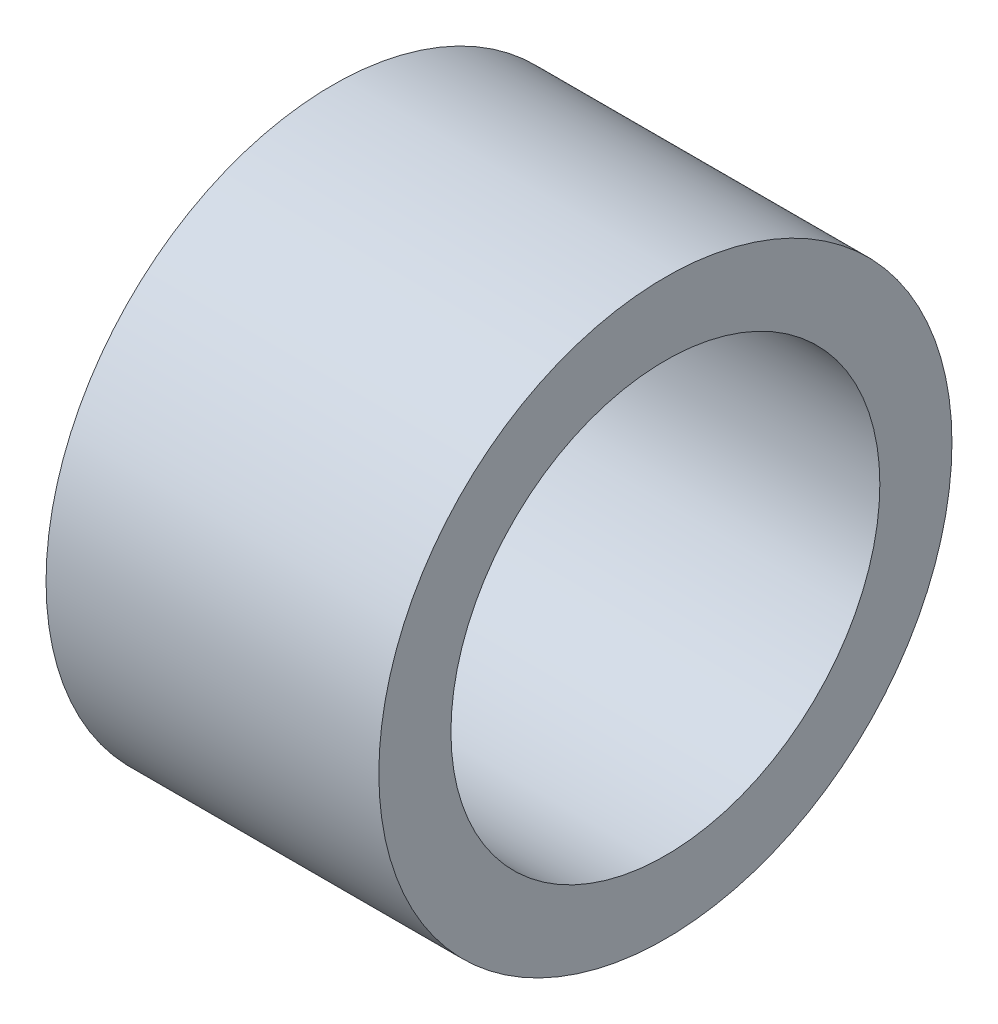
ISO-10303-21;
HEADER;
FILE_DESCRIPTION(('STEP AP214'),'2;1');
FILE_NAME('part.step','',(''),(''),'','','');
FILE_SCHEMA(('AUTOMOTIVE_DESIGN { 1 0 10303 214 1 1 1 1 }'));
ENDSEC;
DATA;
#1=APPLICATION_CONTEXT('core data for automotive mechanical design processes');
#2=APPLICATION_PROTOCOL_DEFINITION('international standard','automotive_design',2000,#1);
#3=PRODUCT_CONTEXT('',#1,'mechanical');
#4=PRODUCT('Part','Part','',(#3));
#5=PRODUCT_RELATED_PRODUCT_CATEGORY('part','',(#4));
#6=PRODUCT_DEFINITION_FORMATION('','',#4);
#7=PRODUCT_DEFINITION_CONTEXT('part definition',#1,'design');
#8=PRODUCT_DEFINITION('design','',#6,#7);
#9=PRODUCT_DEFINITION_SHAPE('','',#8);
#10=(LENGTH_UNIT() NAMED_UNIT(*) SI_UNIT(.MILLI.,.METRE.));
#11=(NAMED_UNIT(*) PLANE_ANGLE_UNIT() SI_UNIT($,.RADIAN.));
#12=(NAMED_UNIT(*) SI_UNIT($,.STERADIAN.) SOLID_ANGLE_UNIT());
#13=UNCERTAINTY_MEASURE_WITH_UNIT(LENGTH_MEASURE(1.E-05),#10,'distance_accuracy_value','');
#14=(GEOMETRIC_REPRESENTATION_CONTEXT(3) GLOBAL_UNCERTAINTY_ASSIGNED_CONTEXT((#13)) GLOBAL_UNIT_ASSIGNED_CONTEXT((#10,
#11,#12)) REPRESENTATION_CONTEXT('',''));
#15=CARTESIAN_POINT('',(0.,0.,0.));
#16=DIRECTION('',(0.,0.,1.));
#17=DIRECTION('',(1.,0.,0.));
#18=AXIS2_PLACEMENT_3D('',#15,#16,#17);
#19=CARTESIAN_POINT('',(9.,0.,0.));
#20=DIRECTION('',(1.,0.,0.));
#21=DIRECTION('',(0.,0.,-1.));
#22=AXIS2_PLACEMENT_3D('',#19,#20,#21);
#23=PLANE('',#22);
#24=CARTESIAN_POINT('',(9.,0.,0.));
#25=DIRECTION('',(1.,0.,0.));
#26=DIRECTION('',(0.,0.,-1.));
#27=AXIS2_PLACEMENT_3D('',#24,#25,#26);
#28=CIRCLE('',#27,7.75);
#29=CARTESIAN_POINT('',(9.,0.,-7.75));
#30=VERTEX_POINT('',#29);
#31=EDGE_CURVE('E10',#30,#30,#28,.T.);
#32=ORIENTED_EDGE('',*,*,#31,.T.);
#33=EDGE_LOOP('',(#32));
#34=FACE_BOUND('',#33,.T.);
#35=CARTESIAN_POINT('',(9.,0.,0.));
#36=DIRECTION('',(1.,0.,0.));
#37=DIRECTION('',(0.,0.,-1.));
#38=AXIS2_PLACEMENT_3D('',#35,#36,#37);
#39=CIRCLE('',#38,5.8);
#40=CARTESIAN_POINT('',(9.,0.,-5.8));
#41=VERTEX_POINT('',#40);
#42=EDGE_CURVE('E50',#41,#41,#39,.T.);
#43=ORIENTED_EDGE('',*,*,#42,.F.);
#44=EDGE_LOOP('',(#43));
#45=FACE_BOUND('',#44,.T.);
#46=ADVANCED_FACE('F36',(#34,#45),#23,.T.);
#47=CARTESIAN_POINT('',(0.,0.,0.));
#48=DIRECTION('',(1.,0.,0.));
#49=DIRECTION('',(0.,0.,-1.));
#50=AXIS2_PLACEMENT_3D('',#47,#48,#49);
#51=PLANE('',#50);
#52=CARTESIAN_POINT('',(0.,0.,0.));
#53=DIRECTION('',(1.,0.,0.));
#54=DIRECTION('',(0.,0.,-1.));
#55=AXIS2_PLACEMENT_3D('',#52,#53,#54);
#56=CIRCLE('',#55,7.75);
#57=CARTESIAN_POINT('',(0.,0.,-7.75));
#58=VERTEX_POINT('',#57);
#59=EDGE_CURVE('E40',#58,#58,#56,.T.);
#60=ORIENTED_EDGE('',*,*,#59,.F.);
#61=EDGE_LOOP('',(#60));
#62=FACE_BOUND('',#61,.T.);
#63=CARTESIAN_POINT('',(0.,0.,0.));
#64=DIRECTION('',(1.,0.,0.));
#65=DIRECTION('',(0.,0.,-1.));
#66=AXIS2_PLACEMENT_3D('',#63,#64,#65);
#67=CIRCLE('',#66,5.8);
#68=CARTESIAN_POINT('',(0.,0.,-5.8));
#69=VERTEX_POINT('',#68);
#70=EDGE_CURVE('E52',#69,#69,#67,.T.);
#71=ORIENTED_EDGE('',*,*,#70,.T.);
#72=EDGE_LOOP('',(#71));
#73=FACE_BOUND('',#72,.T.);
#74=ADVANCED_FACE('F63',(#62,#73),#51,.F.);
#75=CARTESIAN_POINT('',(9.,0.,0.));
#76=DIRECTION('',(-1.,0.,0.));
#77=DIRECTION('',(0.,0.,1.));
#78=AXIS2_PLACEMENT_3D('',#75,#76,#77);
#79=CYLINDRICAL_SURFACE('',#78,7.75);
#80=ORIENTED_EDGE('',*,*,#31,.F.);
#81=EDGE_LOOP('',(#80));
#82=FACE_BOUND('',#81,.T.);
#83=ORIENTED_EDGE('',*,*,#59,.T.);
#84=EDGE_LOOP('',(#83));
#85=FACE_BOUND('',#84,.T.);
#86=ADVANCED_FACE('F38',(#82,#85),#79,.T.);
#87=CARTESIAN_POINT('',(9.,0.,0.));
#88=DIRECTION('',(-1.,0.,0.));
#89=DIRECTION('',(0.,0.,1.));
#90=AXIS2_PLACEMENT_3D('',#87,#88,#89);
#91=CYLINDRICAL_SURFACE('',#90,5.8);
#92=ORIENTED_EDGE('',*,*,#42,.T.);
#93=EDGE_LOOP('',(#92));
#94=FACE_BOUND('',#93,.T.);
#95=ORIENTED_EDGE('',*,*,#70,.F.);
#96=EDGE_LOOP('',(#95));
#97=FACE_BOUND('',#96,.T.);
#98=ADVANCED_FACE('F59',(#94,#97),#91,.F.);
#99=CLOSED_SHELL('',(#46,#74,#86,#98));
#100=MANIFOLD_SOLID_BREP('B2',#99);
#101=ADVANCED_BREP_SHAPE_REPRESENTATION('',(#18,#100),#14);
#102=SHAPE_DEFINITION_REPRESENTATION(#9,#101);
ENDSEC;
END-ISO-10303-21;
